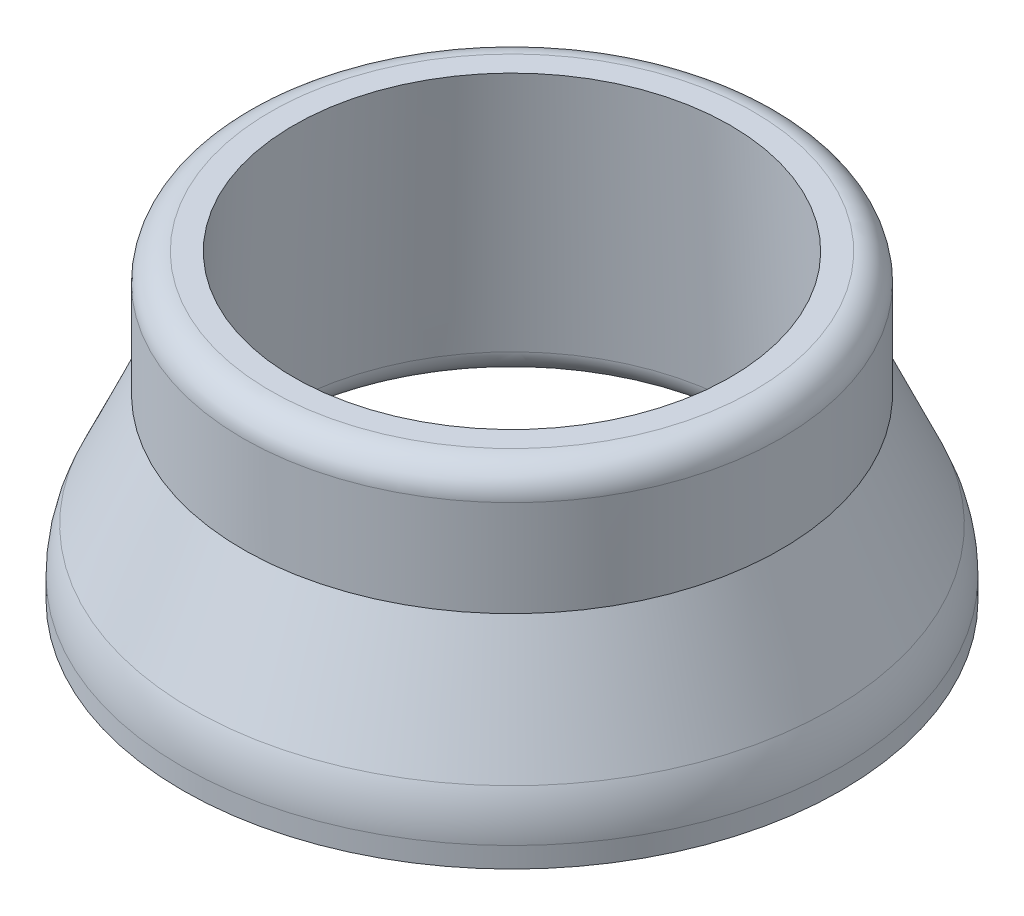
ISO-10303-21;
HEADER;
FILE_DESCRIPTION(('STEP AP214'),'2;1');
FILE_NAME('part.step','',(''),(''),'','','');
FILE_SCHEMA(('AUTOMOTIVE_DESIGN { 1 0 10303 214 1 1 1 1 }'));
ENDSEC;
DATA;
#1=APPLICATION_CONTEXT('core data for automotive mechanical design processes');
#2=APPLICATION_PROTOCOL_DEFINITION('international standard','automotive_design',2000,#1);
#3=PRODUCT_CONTEXT('',#1,'mechanical');
#4=PRODUCT('Part','Part','',(#3));
#5=PRODUCT_RELATED_PRODUCT_CATEGORY('part','',(#4));
#6=PRODUCT_DEFINITION_FORMATION('','',#4);
#7=PRODUCT_DEFINITION_CONTEXT('part definition',#1,'design');
#8=PRODUCT_DEFINITION('design','',#6,#7);
#9=PRODUCT_DEFINITION_SHAPE('','',#8);
#10=(LENGTH_UNIT() NAMED_UNIT(*) SI_UNIT(.MILLI.,.METRE.));
#11=(NAMED_UNIT(*) PLANE_ANGLE_UNIT() SI_UNIT($,.RADIAN.));
#12=(NAMED_UNIT(*) SI_UNIT($,.STERADIAN.) SOLID_ANGLE_UNIT());
#13=UNCERTAINTY_MEASURE_WITH_UNIT(LENGTH_MEASURE(1.E-05),#10,'distance_accuracy_value','');
#14=(GEOMETRIC_REPRESENTATION_CONTEXT(3) GLOBAL_UNCERTAINTY_ASSIGNED_CONTEXT((#13)) GLOBAL_UNIT_ASSIGNED_CONTEXT((#10,
#11,#12)) REPRESENTATION_CONTEXT('',''));
#15=CARTESIAN_POINT('',(0.,0.,0.));
#16=DIRECTION('',(0.,0.,1.));
#17=DIRECTION('',(1.,0.,0.));
#18=AXIS2_PLACEMENT_3D('',#15,#16,#17);
#19=CARTESIAN_POINT('',(0.,11.,0.));
#20=DIRECTION('',(0.,1.,0.));
#21=DIRECTION('',(-1.,0.,0.));
#22=AXIS2_PLACEMENT_3D('',#19,#20,#21);
#23=CYLINDRICAL_SURFACE('',#22,12.);
#24=CARTESIAN_POINT('',(0.,0.743237089457614,0.));
#25=DIRECTION('',(0.,-1.,0.));
#26=DIRECTION('',(1.,0.,0.));
#27=AXIS2_PLACEMENT_3D('',#24,#25,#26);
#28=CIRCLE('',#27,12.);
#29=CARTESIAN_POINT('',(12.,0.743237089457614,0.));
#30=VERTEX_POINT('',#29);
#31=EDGE_CURVE('E10',#30,#30,#28,.T.);
#32=ORIENTED_EDGE('',*,*,#31,.T.);
#33=EDGE_LOOP('',(#32));
#34=FACE_BOUND('',#33,.T.);
#35=CARTESIAN_POINT('',(0.,0.,0.));
#36=DIRECTION('',(0.,-1.,0.));
#37=DIRECTION('',(0.,0.,-1.));
#38=AXIS2_PLACEMENT_3D('',#35,#36,#37);
#39=CIRCLE('',#38,12.);
#40=CARTESIAN_POINT('',(0.,0.,-12.));
#41=VERTEX_POINT('',#40);
#42=EDGE_CURVE('E69',#41,#41,#39,.T.);
#43=ORIENTED_EDGE('',*,*,#42,.F.);
#44=EDGE_LOOP('',(#43));
#45=FACE_BOUND('',#44,.T.);
#46=ADVANCED_FACE('F40',(#34,#45),#23,.T.);
#47=CARTESIAN_POINT('',(0.,1.6,0.));
#48=DIRECTION('',(0.,-1.,0.));
#49=DIRECTION('',(1.,0.,0.));
#50=AXIS2_PLACEMENT_3D('',#47,#48,#49);
#51=CONICAL_SURFACE('',#50,12.,0.422005029902218);
#52=CARTESIAN_POINT('',(0.,2.38159870079297,0.));
#53=DIRECTION('',(0.,1.,0.));
#54=DIRECTION('',(-1.,0.,0.));
#55=AXIS2_PLACEMENT_3D('',#52,#53,#54);
#56=CIRCLE('',#55,11.6490781343379);
#57=CARTESIAN_POINT('',(-11.6490781343379,2.38159870079297,0.));
#58=VERTEX_POINT('',#57);
#59=EDGE_CURVE('E42',#58,#58,#56,.T.);
#60=ORIENTED_EDGE('',*,*,#59,.T.);
#61=EDGE_LOOP('',(#60));
#62=FACE_BOUND('',#61,.T.);
#63=CARTESIAN_POINT('',(0.,6.5,0.));
#64=DIRECTION('',(0.,1.,0.));
#65=DIRECTION('',(-1.,0.,0.));
#66=AXIS2_PLACEMENT_3D('',#63,#64,#65);
#67=CIRCLE('',#66,9.8);
#68=CARTESIAN_POINT('',(-9.8,6.5,0.));
#69=VERTEX_POINT('',#68);
#70=EDGE_CURVE('E61',#69,#69,#67,.T.);
#71=ORIENTED_EDGE('',*,*,#70,.F.);
#72=EDGE_LOOP('',(#71));
#73=FACE_BOUND('',#72,.T.);
#74=ADVANCED_FACE('F78',(#62,#73),#51,.T.);
#75=CARTESIAN_POINT('',(0.,11.,0.));
#76=DIRECTION('',(0.,1.,0.));
#77=DIRECTION('',(-1.,0.,0.));
#78=AXIS2_PLACEMENT_3D('',#75,#76,#77);
#79=CYLINDRICAL_SURFACE('',#78,9.8);
#80=CARTESIAN_POINT('',(0.,10.,0.));
#81=DIRECTION('',(0.,-1.,0.));
#82=DIRECTION('',(1.,0.,0.));
#83=AXIS2_PLACEMENT_3D('',#80,#81,#82);
#84=CIRCLE('',#83,9.8);
#85=CARTESIAN_POINT('',(9.8,10.,0.));
#86=VERTEX_POINT('',#85);
#87=EDGE_CURVE('E60',#86,#86,#84,.T.);
#88=ORIENTED_EDGE('',*,*,#87,.T.);
#89=EDGE_LOOP('',(#88));
#90=FACE_BOUND('',#89,.T.);
#91=ORIENTED_EDGE('',*,*,#70,.T.);
#92=EDGE_LOOP('',(#91));
#93=FACE_BOUND('',#92,.T.);
#94=ADVANCED_FACE('F85',(#90,#93),#79,.T.);
#95=CARTESIAN_POINT('',(9.8,11.,0.));
#96=DIRECTION('',(0.,-1.,0.));
#97=DIRECTION('',(1.,0.,0.));
#98=AXIS2_PLACEMENT_3D('',#95,#96,#97);
#99=PLANE('',#98);
#100=CARTESIAN_POINT('',(0.,11.,0.));
#101=DIRECTION('',(0.,-1.,0.));
#102=DIRECTION('',(1.,0.,0.));
#103=AXIS2_PLACEMENT_3D('',#100,#101,#102);
#104=CIRCLE('',#103,8.8);
#105=CARTESIAN_POINT('',(8.8,11.,0.));
#106=VERTEX_POINT('',#105);
#107=EDGE_CURVE('E58',#106,#106,#104,.F.);
#108=ORIENTED_EDGE('',*,*,#107,.T.);
#109=EDGE_LOOP('',(#108));
#110=FACE_BOUND('',#109,.T.);
#111=CARTESIAN_POINT('',(0.,11.,0.));
#112=DIRECTION('',(0.,-1.,0.));
#113=DIRECTION('',(0.,0.,-1.));
#114=AXIS2_PLACEMENT_3D('',#111,#112,#113);
#115=CIRCLE('',#114,7.95);
#116=CARTESIAN_POINT('',(0.,11.,-7.95));
#117=VERTEX_POINT('',#116);
#118=EDGE_CURVE('E68',#117,#117,#115,.T.);
#119=ORIENTED_EDGE('',*,*,#118,.T.);
#120=EDGE_LOOP('',(#119));
#121=FACE_BOUND('',#120,.T.);
#122=ADVANCED_FACE('F103',(#110,#121),#99,.F.);
#123=CARTESIAN_POINT('',(0.,1.2,0.));
#124=DIRECTION('',(0.,-1.,0.));
#125=DIRECTION('',(0.,0.,-1.));
#126=AXIS2_PLACEMENT_3D('',#123,#124,#125);
#127=CONICAL_SURFACE('',#126,8.45,0.0509762070753133);
#128=CARTESIAN_POINT('',(0.,1.87874932459159,0.));
#129=DIRECTION('',(0.,1.,0.));
#130=DIRECTION('',(0.,0.,1.));
#131=AXIS2_PLACEMENT_3D('',#128,#129,#130);
#132=CIRCLE('',#131,8.4153699324188);
#133=CARTESIAN_POINT('',(0.,1.87874932459159,8.4153699324188));
#134=VERTEX_POINT('',#133);
#135=EDGE_CURVE('E55',#134,#134,#132,.F.);
#136=ORIENTED_EDGE('',*,*,#135,.T.);
#137=EDGE_LOOP('',(#136));
#138=FACE_BOUND('',#137,.T.);
#139=ORIENTED_EDGE('',*,*,#118,.F.);
#140=EDGE_LOOP('',(#139));
#141=FACE_BOUND('',#140,.T.);
#142=ADVANCED_FACE('F99',(#138,#141),#127,.F.);
#143=CARTESIAN_POINT('',(0.,0.,0.));
#144=DIRECTION('',(0.,-1.,0.));
#145=DIRECTION('',(0.,0.,-1.));
#146=AXIS2_PLACEMENT_3D('',#143,#144,#145);
#147=CONICAL_SURFACE('',#146,12.,1.24482638815525);
#148=CARTESIAN_POINT('',(0.,0.982362886195358,0.));
#149=DIRECTION('',(0.,1.,0.));
#150=DIRECTION('',(0.,0.,1.));
#151=AXIS2_PLACEMENT_3D('',#148,#149,#150);
#152=CIRCLE('',#151,9.09384312833873);
#153=CARTESIAN_POINT('',(0.,0.982362886195358,9.09384312833873));
#154=VERTEX_POINT('',#153);
#155=EDGE_CURVE('E48',#154,#154,#152,.T.);
#156=ORIENTED_EDGE('',*,*,#155,.T.);
#157=EDGE_LOOP('',(#156));
#158=FACE_BOUND('',#157,.T.);
#159=ORIENTED_EDGE('',*,*,#42,.T.);
#160=EDGE_LOOP('',(#159));
#161=FACE_BOUND('',#160,.T.);
#162=ADVANCED_FACE('F71',(#158,#161),#147,.F.);
#163=CARTESIAN_POINT('',(0.,10.,0.));
#164=DIRECTION('',(0.,-1.,0.));
#165=DIRECTION('',(1.,0.,0.));
#166=AXIS2_PLACEMENT_3D('',#163,#164,#165);
#167=TOROIDAL_SURFACE('',#166,8.8,1.);
#168=ORIENTED_EDGE('',*,*,#87,.F.);
#169=EDGE_LOOP('',(#168));
#170=FACE_BOUND('',#169,.T.);
#171=ORIENTED_EDGE('',*,*,#107,.F.);
#172=EDGE_LOOP('',(#171));
#173=FACE_BOUND('',#172,.T.);
#174=ADVANCED_FACE('F88',(#170,#173),#167,.T.);
#175=CARTESIAN_POINT('',(0.,1.92970345696351,0.));
#176=DIRECTION('',(0.,1.,0.));
#177=DIRECTION('',(0.,0.,1.));
#178=AXIS2_PLACEMENT_3D('',#175,#176,#177);
#179=TOROIDAL_SURFACE('',#178,9.41407092690825,1.);
#180=ORIENTED_EDGE('',*,*,#155,.F.);
#181=EDGE_LOOP('',(#180));
#182=FACE_BOUND('',#181,.T.);
#183=ORIENTED_EDGE('',*,*,#135,.F.);
#184=EDGE_LOOP('',(#183));
#185=FACE_BOUND('',#184,.T.);
#186=ADVANCED_FACE('F86',(#182,#185),#179,.T.);
#187=CARTESIAN_POINT('',(0.,0.743237089457613,0.));
#188=DIRECTION('',(0.,-1.,0.));
#189=DIRECTION('',(1.,0.,0.));
#190=AXIS2_PLACEMENT_3D('',#187,#188,#189);
#191=TOROIDAL_SURFACE('',#190,8.,4.);
#192=ORIENTED_EDGE('',*,*,#31,.F.);
#193=EDGE_LOOP('',(#192));
#194=FACE_BOUND('',#193,.T.);
#195=ORIENTED_EDGE('',*,*,#59,.F.);
#196=EDGE_LOOP('',(#195));
#197=FACE_BOUND('',#196,.T.);
#198=ADVANCED_FACE('F39',(#194,#197),#191,.T.);
#199=CLOSED_SHELL('',(#46,#74,#94,#122,#142,#162,#174,#186,#198));
#200=MANIFOLD_SOLID_BREP('B2',#199);
#201=ADVANCED_BREP_SHAPE_REPRESENTATION('',(#18,#200),#14);
#202=SHAPE_DEFINITION_REPRESENTATION(#9,#201);
ENDSEC;
END-ISO-10303-21;
